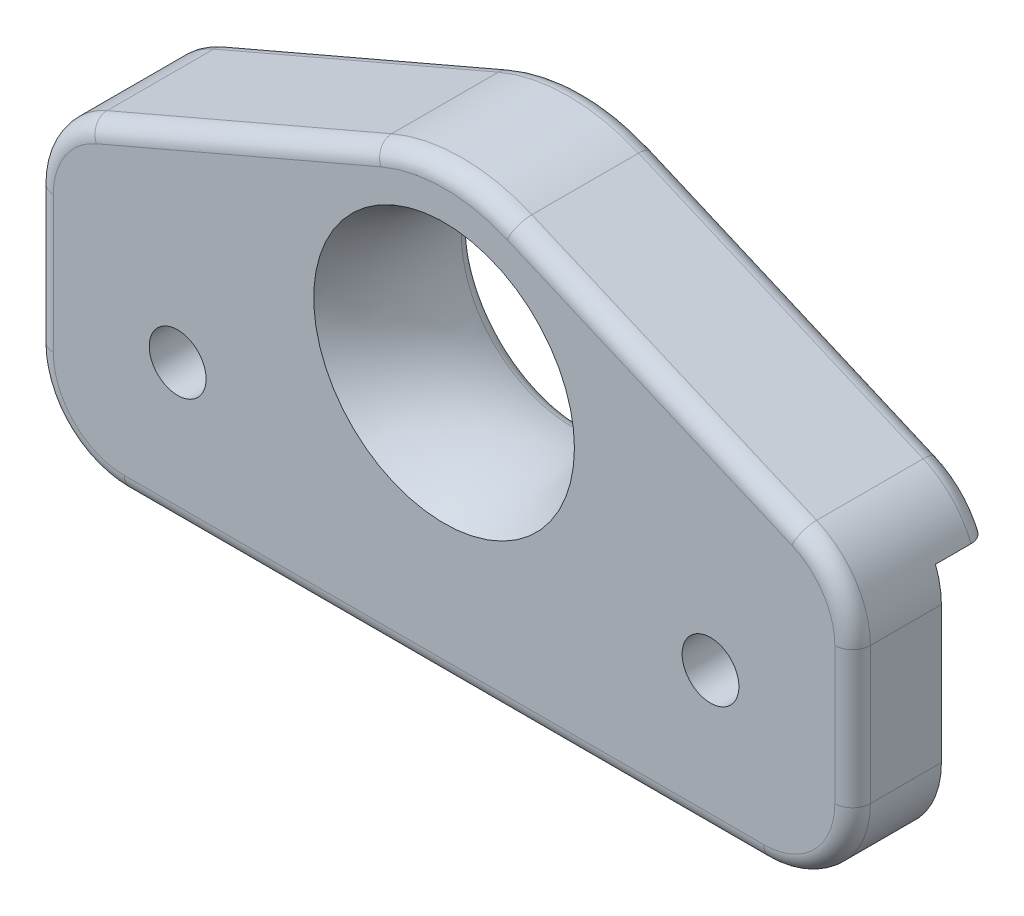
ISO-10303-21;
HEADER;
FILE_DESCRIPTION(('STEP AP214'),'2;1');
FILE_NAME('part.step','',(''),(''),'','','');
FILE_SCHEMA(('AUTOMOTIVE_DESIGN { 1 0 10303 214 1 1 1 1 }'));
ENDSEC;
DATA;
#1=APPLICATION_CONTEXT('core data for automotive mechanical design processes');
#2=APPLICATION_PROTOCOL_DEFINITION('international standard','automotive_design',2000,#1);
#3=PRODUCT_CONTEXT('',#1,'mechanical');
#4=PRODUCT('Part','Part','',(#3));
#5=PRODUCT_RELATED_PRODUCT_CATEGORY('part','',(#4));
#6=PRODUCT_DEFINITION_FORMATION('','',#4);
#7=PRODUCT_DEFINITION_CONTEXT('part definition',#1,'design');
#8=PRODUCT_DEFINITION('design','',#6,#7);
#9=PRODUCT_DEFINITION_SHAPE('','',#8);
#10=(LENGTH_UNIT() NAMED_UNIT(*) SI_UNIT(.MILLI.,.METRE.));
#11=(NAMED_UNIT(*) PLANE_ANGLE_UNIT() SI_UNIT($,.RADIAN.));
#12=(NAMED_UNIT(*) SI_UNIT($,.STERADIAN.) SOLID_ANGLE_UNIT());
#13=UNCERTAINTY_MEASURE_WITH_UNIT(LENGTH_MEASURE(1.E-05),#10,'distance_accuracy_value','');
#14=(GEOMETRIC_REPRESENTATION_CONTEXT(3) GLOBAL_UNCERTAINTY_ASSIGNED_CONTEXT((#13)) GLOBAL_UNIT_ASSIGNED_CONTEXT((#10,
#11,#12)) REPRESENTATION_CONTEXT('',''));
#15=CARTESIAN_POINT('',(0.,0.,0.));
#16=DIRECTION('',(0.,0.,1.));
#17=DIRECTION('',(1.,0.,0.));
#18=AXIS2_PLACEMENT_3D('',#15,#16,#17);
#19=CARTESIAN_POINT('',(-23.,-0.500000000000005,0.));
#20=DIRECTION('',(0.,1.,0.));
#21=DIRECTION('',(-1.,0.,0.));
#22=AXIS2_PLACEMENT_3D('',#19,#20,#21);
#23=PLANE('',#22);
#24=DIRECTION('',(1.,0.,0.));
#25=VECTOR('',#24,1.);
#26=CARTESIAN_POINT('',(-23.,-0.500000000000005,0.));
#27=LINE('',#26,#25);
#28=CARTESIAN_POINT('',(7.98435971133566,-0.499999999999999,0.));
#29=VERTEX_POINT('',#28);
#30=CARTESIAN_POINT('',(21.5754322402372,-0.499999999999996,0.));
#31=VERTEX_POINT('',#30);
#32=EDGE_CURVE('E203',#29,#31,#27,.T.);
#33=ORIENTED_EDGE('',*,*,#32,.T.);
#34=CARTESIAN_POINT('',(21.5754322402372,-0.499999999999997,0.));
#35=CARTESIAN_POINT('',(21.6419406279155,-0.499999999999996,-4.29555678483325E-05));
#36=CARTESIAN_POINT('',(21.7085231135193,-0.499999999999996,0.00530162449804705));
#37=CARTESIAN_POINT('',(21.8401270357918,-0.499999999999996,0.0269033733399253));
#38=CARTESIAN_POINT('',(21.9051420402658,-0.499999999999996,0.0431994888706257));
#39=CARTESIAN_POINT('',(22.0315701648763,-0.499999999999996,0.0869031052285832));
#40=CARTESIAN_POINT('',(22.0929729964198,-0.499999999999996,0.114340737607372));
#41=CARTESIAN_POINT('',(22.2096663555396,-0.499999999999996,0.179938208452123));
#42=CARTESIAN_POINT('',(22.2649672736383,-0.499999999999996,0.218079415366952));
#43=CARTESIAN_POINT('',(22.3633396600314,-0.499999999999996,0.30093072112407));
#44=CARTESIAN_POINT('',(22.4070238014305,-0.499999999999996,0.344912593751883));
#45=CARTESIAN_POINT('',(22.4855839041599,-0.499999999999996,0.440196796855842));
#46=CARTESIAN_POINT('',(22.5204593727202,-0.499999999999996,0.491499536621005));
#47=CARTESIAN_POINT('',(22.5773540011421,-0.499999999999996,0.595264207760719));
#48=CARTESIAN_POINT('',(22.6002023011048,-0.499999999999996,0.647273309684651));
#49=CARTESIAN_POINT('',(22.6362415470775,-0.499999999999996,0.754491026960397));
#50=CARTESIAN_POINT('',(22.6494495978546,-0.499999999999996,0.809693786962876));
#51=CARTESIAN_POINT('',(22.660816495334,-0.499999999999996,0.887835965218752));
#52=CARTESIAN_POINT('',(22.6632489454401,-0.499999999999996,0.910217852013244));
#53=CARTESIAN_POINT('',(22.6664902598927,-0.499999999999996,0.955062682164826));
#54=CARTESIAN_POINT('',(22.6673017314686,-0.499999999999996,0.977525437046325));
#55=CARTESIAN_POINT('',(22.6673028297432,-0.499999999999996,0.999999999999981));
#56=B_SPLINE_CURVE_WITH_KNOTS('',3,(#34,#35,#36,#37,#38,#39,#40,#41,#42,#43,#44,#45,#46,#47,#48,
#49,#50,#51,#52,#53,#54,#55),.UNSPECIFIED.,.F.,.F.,(4,2,2,2,2,2,2,2,2,2,4),(0.,
0.199425013428973,0.399563018176547,0.600245927547438,0.800581655178774,0.985551444115997,
1.17053157824643,1.3400974418541,1.50936170718863,1.57685592382779,1.64424149309941),.UNSPECIFIED.);
#57=CARTESIAN_POINT('',(22.6673028297431,-0.499999999999996,1.));
#58=VERTEX_POINT('',#57);
#59=EDGE_CURVE('E285',#31,#58,#56,.T.);
#60=ORIENTED_EDGE('',*,*,#59,.T.);
#61=DIRECTION('',(0.,0.,-1.));
#62=VECTOR('',#61,1.);
#63=CARTESIAN_POINT('',(22.6673028297431,-0.499999999999996,0.));
#64=LINE('',#63,#62);
#65=CARTESIAN_POINT('',(22.6673028297431,-0.499999999999996,3.));
#66=VERTEX_POINT('',#65);
#67=EDGE_CURVE('E271',#58,#66,#64,.F.);
#68=ORIENTED_EDGE('',*,*,#67,.T.);
#69=DIRECTION('',(1.,0.,0.));
#70=VECTOR('',#69,1.);
#71=CARTESIAN_POINT('',(-23.,-0.500000000000005,3.));
#72=LINE('',#71,#70);
#73=CARTESIAN_POINT('',(7.98435971133566,-0.499999999999999,3.));
#74=VERTEX_POINT('',#73);
#75=EDGE_CURVE('E205',#74,#66,#72,.T.);
#76=ORIENTED_EDGE('',*,*,#75,.F.);
#77=DIRECTION('',(0.,0.,-1.));
#78=VECTOR('',#77,1.);
#79=CARTESIAN_POINT('',(7.98435971133565,-0.499999999999999,25.6274169979695));
#80=LINE('',#79,#78);
#81=EDGE_CURVE('E190',#74,#29,#80,.T.);
#82=ORIENTED_EDGE('',*,*,#81,.T.);
#83=EDGE_LOOP('',(#33,#60,#68,#76,#82));
#84=FACE_BOUND('',#83,.T.);
#85=ADVANCED_FACE('F34',(#84),#23,.F.);
#86=CARTESIAN_POINT('',(0.,0.,8.));
#87=DIRECTION('',(0.,0.,-1.));
#88=DIRECTION('',(-1.,0.,0.));
#89=AXIS2_PLACEMENT_3D('',#86,#87,#88);
#90=PLANE('',#89);
#91=CARTESIAN_POINT('',(18.,-2.29340020504966,8.));
#92=DIRECTION('',(0.,0.,-1.));
#93=DIRECTION('',(-1.,0.,0.));
#94=AXIS2_PLACEMENT_3D('',#91,#92,#93);
#95=CIRCLE('',#94,4.);
#96=CARTESIAN_POINT('',(22.,-2.29340020504965,8.));
#97=VERTEX_POINT('',#96);
#98=CARTESIAN_POINT('',(19.5793476124277,1.38160470911289,8.));
#99=VERTEX_POINT('',#98);
#100=EDGE_CURVE('E523',#97,#99,#95,.F.);
#101=ORIENTED_EDGE('',*,*,#100,.T.);
#102=DIRECTION('',(-0.918751228540637,0.394836903106929,0.));
#103=VECTOR('',#102,1.);
#104=CARTESIAN_POINT('',(3.55353212796237,8.26876105686574,8.));
#105=LINE('',#104,#103);
#106=CARTESIAN_POINT('',(3.55353212796236,8.26876105686574,8.));
#107=VERTEX_POINT('',#106);
#108=EDGE_CURVE('E525',#99,#107,#105,.T.);
#109=ORIENTED_EDGE('',*,*,#108,.T.);
#110=CARTESIAN_POINT('',(0.,0.,8.));
#111=DIRECTION('',(0.,0.,-1.));
#112=DIRECTION('',(-1.,0.,0.));
#113=AXIS2_PLACEMENT_3D('',#110,#111,#112);
#114=CIRCLE('',#113,9.00000000000001);
#115=CARTESIAN_POINT('',(-3.55353212796236,8.26876105686573,8.));
#116=VERTEX_POINT('',#115);
#117=EDGE_CURVE('E547',#107,#116,#114,.F.);
#118=ORIENTED_EDGE('',*,*,#117,.T.);
#119=DIRECTION('',(-0.918751228540637,-0.394836903106929,0.));
#120=VECTOR('',#119,1.);
#121=CARTESIAN_POINT('',(-3.55353212796236,8.26876105686574,8.));
#122=LINE('',#121,#120);
#123=CARTESIAN_POINT('',(-19.5793476124277,1.38160470911289,8.));
#124=VERTEX_POINT('',#123);
#125=EDGE_CURVE('E549',#116,#124,#122,.T.);
#126=ORIENTED_EDGE('',*,*,#125,.T.);
#127=CARTESIAN_POINT('',(-18.,-2.29340020504966,8.));
#128=DIRECTION('',(0.,0.,-1.));
#129=DIRECTION('',(-1.,0.,0.));
#130=AXIS2_PLACEMENT_3D('',#127,#128,#129);
#131=CIRCLE('',#130,4.);
#132=CARTESIAN_POINT('',(-22.,-2.29340020504965,8.));
#133=VERTEX_POINT('',#132);
#134=EDGE_CURVE('E516',#124,#133,#131,.F.);
#135=ORIENTED_EDGE('',*,*,#134,.T.);
#136=DIRECTION('',(0.,-1.,0.));
#137=VECTOR('',#136,1.);
#138=CARTESIAN_POINT('',(-22.,0.,8.));
#139=LINE('',#138,#137);
#140=CARTESIAN_POINT('',(-22.,-9.99999999999999,8.));
#141=VERTEX_POINT('',#140);
#142=EDGE_CURVE('E506',#133,#141,#139,.T.);
#143=ORIENTED_EDGE('',*,*,#142,.T.);
#144=CARTESIAN_POINT('',(-18.,-10.,8.));
#145=DIRECTION('',(0.,0.,-1.));
#146=DIRECTION('',(-1.,0.,0.));
#147=AXIS2_PLACEMENT_3D('',#144,#145,#146);
#148=CIRCLE('',#147,4.);
#149=CARTESIAN_POINT('',(-18.,-14.,8.));
#150=VERTEX_POINT('',#149);
#151=EDGE_CURVE('E510',#141,#150,#148,.F.);
#152=ORIENTED_EDGE('',*,*,#151,.T.);
#153=DIRECTION('',(1.,0.,0.));
#154=VECTOR('',#153,1.);
#155=CARTESIAN_POINT('',(0.,-14.,8.));
#156=LINE('',#155,#154);
#157=CARTESIAN_POINT('',(18.,-14.,8.));
#158=VERTEX_POINT('',#157);
#159=EDGE_CURVE('E512',#150,#158,#156,.T.);
#160=ORIENTED_EDGE('',*,*,#159,.T.);
#161=CARTESIAN_POINT('',(18.,-10.,8.));
#162=DIRECTION('',(0.,0.,-1.));
#163=DIRECTION('',(-1.,0.,0.));
#164=AXIS2_PLACEMENT_3D('',#161,#162,#163);
#165=CIRCLE('',#164,4.);
#166=CARTESIAN_POINT('',(22.,-9.99999999999999,8.));
#167=VERTEX_POINT('',#166);
#168=EDGE_CURVE('E514',#158,#167,#165,.F.);
#169=ORIENTED_EDGE('',*,*,#168,.T.);
#170=DIRECTION('',(0.,1.,0.));
#171=VECTOR('',#170,1.);
#172=CARTESIAN_POINT('',(22.,0.,8.));
#173=LINE('',#172,#171);
#174=EDGE_CURVE('E521',#167,#97,#173,.T.);
#175=ORIENTED_EDGE('',*,*,#174,.T.);
#176=EDGE_LOOP('',(#101,#109,#118,#126,#135,#143,#152,#160,#169,#175));
#177=FACE_BOUND('',#176,.T.);
#178=CARTESIAN_POINT('',(0.,0.,8.));
#179=DIRECTION('',(0.,0.,1.));
#180=DIRECTION('',(1.,0.,0.));
#181=AXIS2_PLACEMENT_3D('',#178,#179,#180);
#182=CIRCLE('',#181,7.33974596215561);
#183=CARTESIAN_POINT('',(7.33974596215561,0.,8.));
#184=VERTEX_POINT('',#183);
#185=EDGE_CURVE('E198',#184,#184,#182,.T.);
#186=ORIENTED_EDGE('',*,*,#185,.F.);
#187=EDGE_LOOP('',(#186));
#188=FACE_BOUND('',#187,.T.);
#189=CARTESIAN_POINT('',(-15.,-7.,8.));
#190=DIRECTION('',(0.,0.,1.));
#191=DIRECTION('',(1.,0.,0.));
#192=AXIS2_PLACEMENT_3D('',#189,#190,#191);
#193=CIRCLE('',#192,1.6);
#194=CARTESIAN_POINT('',(-13.4,-7.,8.));
#195=VERTEX_POINT('',#194);
#196=EDGE_CURVE('E229',#195,#195,#193,.T.);
#197=ORIENTED_EDGE('',*,*,#196,.F.);
#198=EDGE_LOOP('',(#197));
#199=FACE_BOUND('',#198,.T.);
#200=CARTESIAN_POINT('',(15.,-7.,8.));
#201=DIRECTION('',(0.,0.,1.));
#202=DIRECTION('',(-1.,0.,0.));
#203=AXIS2_PLACEMENT_3D('',#200,#201,#202);
#204=CIRCLE('',#203,1.6);
#205=CARTESIAN_POINT('',(13.4,-7.,8.));
#206=VERTEX_POINT('',#205);
#207=EDGE_CURVE('E225',#206,#206,#204,.T.);
#208=ORIENTED_EDGE('',*,*,#207,.F.);
#209=EDGE_LOOP('',(#208));
#210=FACE_BOUND('',#209,.T.);
#211=ADVANCED_FACE('F377',(#177,#188,#199,#210),#90,.F.);
#212=CARTESIAN_POINT('',(0.,0.,0.));
#213=DIRECTION('',(0.,0.,-1.));
#214=DIRECTION('',(-1.,0.,0.));
#215=AXIS2_PLACEMENT_3D('',#212,#213,#214);
#216=PLANE('',#215);
#217=CARTESIAN_POINT('',(0.,0.,0.));
#218=DIRECTION('',(0.,0.,-1.));
#219=DIRECTION('',(-1.,0.,0.));
#220=AXIS2_PLACEMENT_3D('',#217,#218,#219);
#221=CIRCLE('',#220,7.22503561260788);
#222=CARTESIAN_POINT('',(-7.22503561260788,0.,0.));
#223=VERTEX_POINT('',#222);
#224=EDGE_CURVE('E282',#223,#223,#221,.F.);
#225=ORIENTED_EDGE('',*,*,#224,.T.);
#226=EDGE_LOOP('',(#225));
#227=FACE_BOUND('',#226,.T.);
#228=DIRECTION('',(-0.918751228540637,0.394836903106929,0.));
#229=VECTOR('',#228,1.);
#230=CARTESIAN_POINT('',(19.5793476124277,1.38160470911289,0.));
#231=LINE('',#230,#229);
#232=CARTESIAN_POINT('',(3.55353212796236,8.26876105686573,0.));
#233=VERTEX_POINT('',#232);
#234=CARTESIAN_POINT('',(19.5793476124277,1.38160470911289,0.));
#235=VERTEX_POINT('',#234);
#236=EDGE_CURVE('E279',#233,#235,#231,.F.);
#237=ORIENTED_EDGE('',*,*,#236,.T.);
#238=CARTESIAN_POINT('',(18.,-2.29340020504966,0.));
#239=DIRECTION('',(0.,0.,-1.));
#240=DIRECTION('',(-1.,0.,0.));
#241=AXIS2_PLACEMENT_3D('',#238,#239,#240);
#242=CIRCLE('',#241,4.);
#243=EDGE_CURVE('E211',#235,#31,#242,.T.);
#244=ORIENTED_EDGE('',*,*,#243,.T.);
#245=ORIENTED_EDGE('',*,*,#32,.F.);
#246=CARTESIAN_POINT('',(0.,0.,0.));
#247=DIRECTION('',(0.,0.,-1.));
#248=DIRECTION('',(-1.,0.,0.));
#249=AXIS2_PLACEMENT_3D('',#246,#247,#248);
#250=CIRCLE('',#249,8.);
#251=CARTESIAN_POINT('',(-7.98435971133565,-0.500000000000002,0.));
#252=VERTEX_POINT('',#251);
#253=EDGE_CURVE('E186',#29,#252,#250,.T.);
#254=ORIENTED_EDGE('',*,*,#253,.T.);
#255=CARTESIAN_POINT('',(-21.5754322402372,-0.500000000000005,0.));
#256=VERTEX_POINT('',#255);
#257=EDGE_CURVE('E212',#256,#252,#27,.T.);
#258=ORIENTED_EDGE('',*,*,#257,.F.);
#259=CARTESIAN_POINT('',(-18.,-2.29340020504966,0.));
#260=DIRECTION('',(0.,0.,-1.));
#261=DIRECTION('',(-1.,0.,0.));
#262=AXIS2_PLACEMENT_3D('',#259,#260,#261);
#263=CIRCLE('',#262,4.);
#264=CARTESIAN_POINT('',(-19.5793476124277,1.38160470911289,0.));
#265=VERTEX_POINT('',#264);
#266=EDGE_CURVE('E277',#256,#265,#263,.T.);
#267=ORIENTED_EDGE('',*,*,#266,.T.);
#268=DIRECTION('',(-0.918751228540637,-0.394836903106929,0.));
#269=VECTOR('',#268,1.);
#270=CARTESIAN_POINT('',(-3.55353212796236,8.26876105686574,0.));
#271=LINE('',#270,#269);
#272=CARTESIAN_POINT('',(-3.55353212796236,8.26876105686573,0.));
#273=VERTEX_POINT('',#272);
#274=EDGE_CURVE('E275',#265,#273,#271,.F.);
#275=ORIENTED_EDGE('',*,*,#274,.T.);
#276=CARTESIAN_POINT('',(0.,0.,0.));
#277=DIRECTION('',(0.,0.,-1.));
#278=DIRECTION('',(-1.,0.,0.));
#279=AXIS2_PLACEMENT_3D('',#276,#277,#278);
#280=CIRCLE('',#279,9.00000000000001);
#281=EDGE_CURVE('E273',#273,#233,#280,.T.);
#282=ORIENTED_EDGE('',*,*,#281,.T.);
#283=EDGE_LOOP('',(#237,#244,#245,#254,#258,#267,#275,#282));
#284=FACE_BOUND('',#283,.T.);
#285=ADVANCED_FACE('F209',(#227,#284),#216,.T.);
#286=CARTESIAN_POINT('',(-23.,1.,8.));
#287=DIRECTION('',(1.,0.,0.));
#288=DIRECTION('',(0.,1.,0.));
#289=AXIS2_PLACEMENT_3D('',#286,#287,#288);
#290=PLANE('',#289);
#291=DIRECTION('',(0.,0.,-1.));
#292=VECTOR('',#291,1.);
#293=CARTESIAN_POINT('',(-23.,-9.99999999999999,8.));
#294=LINE('',#293,#292);
#295=CARTESIAN_POINT('',(-23.,-10.,3.));
#296=VERTEX_POINT('',#295);
#297=CARTESIAN_POINT('',(-23.,-9.99999999999999,7.));
#298=VERTEX_POINT('',#297);
#299=EDGE_CURVE('E255',#296,#298,#294,.F.);
#300=ORIENTED_EDGE('',*,*,#299,.T.);
#301=DIRECTION('',(0.,-1.,0.));
#302=VECTOR('',#301,1.);
#303=CARTESIAN_POINT('',(-23.,1.,7.));
#304=LINE('',#303,#302);
#305=CARTESIAN_POINT('',(-23.,-2.29340020504965,7.));
#306=VERTEX_POINT('',#305);
#307=EDGE_CURVE('E507',#298,#306,#304,.F.);
#308=ORIENTED_EDGE('',*,*,#307,.T.);
#309=DIRECTION('',(0.,0.,-1.));
#310=VECTOR('',#309,1.);
#311=CARTESIAN_POINT('',(-23.,-2.29340020504965,8.));
#312=LINE('',#311,#310);
#313=CARTESIAN_POINT('',(-23.,-2.29340020504965,3.));
#314=VERTEX_POINT('',#313);
#315=EDGE_CURVE('E253',#306,#314,#312,.T.);
#316=ORIENTED_EDGE('',*,*,#315,.T.);
#317=DIRECTION('',(0.,-1.,0.));
#318=VECTOR('',#317,1.);
#319=CARTESIAN_POINT('',(-23.,-15.,3.));
#320=LINE('',#319,#318);
#321=EDGE_CURVE('E213',#314,#296,#320,.T.);
#322=ORIENTED_EDGE('',*,*,#321,.T.);
#323=EDGE_LOOP('',(#300,#308,#316,#322));
#324=FACE_BOUND('',#323,.T.);
#325=ADVANCED_FACE('F386',(#324),#290,.F.);
#326=CARTESIAN_POINT('',(-23.,-15.,8.));
#327=DIRECTION('',(0.,1.,0.));
#328=DIRECTION('',(0.,0.,1.));
#329=AXIS2_PLACEMENT_3D('',#326,#327,#328);
#330=PLANE('',#329);
#331=DIRECTION('',(0.,0.,-1.));
#332=VECTOR('',#331,1.);
#333=CARTESIAN_POINT('',(18.,-15.,8.));
#334=LINE('',#333,#332);
#335=CARTESIAN_POINT('',(18.,-15.,3.));
#336=VERTEX_POINT('',#335);
#337=CARTESIAN_POINT('',(18.,-15.,7.));
#338=VERTEX_POINT('',#337);
#339=EDGE_CURVE('E206',#336,#338,#334,.F.);
#340=ORIENTED_EDGE('',*,*,#339,.T.);
#341=DIRECTION('',(1.,0.,0.));
#342=VECTOR('',#341,1.);
#343=CARTESIAN_POINT('',(-23.,-15.,7.));
#344=LINE('',#343,#342);
#345=CARTESIAN_POINT('',(-18.,-15.,7.));
#346=VERTEX_POINT('',#345);
#347=EDGE_CURVE('E59',#338,#346,#344,.F.);
#348=ORIENTED_EDGE('',*,*,#347,.T.);
#349=DIRECTION('',(0.,0.,-1.));
#350=VECTOR('',#349,1.);
#351=CARTESIAN_POINT('',(-18.,-15.,8.));
#352=LINE('',#351,#350);
#353=CARTESIAN_POINT('',(-18.,-15.,3.));
#354=VERTEX_POINT('',#353);
#355=EDGE_CURVE('E243',#346,#354,#352,.T.);
#356=ORIENTED_EDGE('',*,*,#355,.T.);
#357=DIRECTION('',(1.,0.,0.));
#358=VECTOR('',#357,1.);
#359=CARTESIAN_POINT('',(-23.,-15.,3.));
#360=LINE('',#359,#358);
#361=EDGE_CURVE('E240',#354,#336,#360,.T.);
#362=ORIENTED_EDGE('',*,*,#361,.T.);
#363=EDGE_LOOP('',(#340,#348,#356,#362));
#364=FACE_BOUND('',#363,.T.);
#365=ADVANCED_FACE('F407',(#364),#330,.F.);
#366=CARTESIAN_POINT('',(23.,1.,8.));
#367=DIRECTION('',(-1.,0.,0.));
#368=DIRECTION('',(0.,-1.,0.));
#369=AXIS2_PLACEMENT_3D('',#366,#367,#368);
#370=PLANE('',#369);
#371=DIRECTION('',(0.,0.,-1.));
#372=VECTOR('',#371,1.);
#373=CARTESIAN_POINT('',(23.,-2.29340020504965,8.));
#374=LINE('',#373,#372);
#375=CARTESIAN_POINT('',(23.,-2.29340020504965,3.));
#376=VERTEX_POINT('',#375);
#377=CARTESIAN_POINT('',(23.,-2.29340020504965,7.));
#378=VERTEX_POINT('',#377);
#379=EDGE_CURVE('E263',#376,#378,#374,.F.);
#380=ORIENTED_EDGE('',*,*,#379,.T.);
#381=DIRECTION('',(0.,1.,0.));
#382=VECTOR('',#381,1.);
#383=CARTESIAN_POINT('',(23.,1.,7.));
#384=LINE('',#383,#382);
#385=CARTESIAN_POINT('',(23.,-9.99999999999999,7.));
#386=VERTEX_POINT('',#385);
#387=EDGE_CURVE('E528',#378,#386,#384,.F.);
#388=ORIENTED_EDGE('',*,*,#387,.T.);
#389=DIRECTION('',(0.,0.,-1.));
#390=VECTOR('',#389,1.);
#391=CARTESIAN_POINT('',(23.,-9.99999999999999,8.));
#392=LINE('',#391,#390);
#393=CARTESIAN_POINT('',(23.,-10.,3.));
#394=VERTEX_POINT('',#393);
#395=EDGE_CURVE('E266',#386,#394,#392,.T.);
#396=ORIENTED_EDGE('',*,*,#395,.T.);
#397=DIRECTION('',(0.,-1.,0.));
#398=VECTOR('',#397,1.);
#399=CARTESIAN_POINT('',(23.,-15.,3.));
#400=LINE('',#399,#398);
#401=EDGE_CURVE('E216',#376,#394,#400,.T.);
#402=ORIENTED_EDGE('',*,*,#401,.F.);
#403=EDGE_LOOP('',(#380,#388,#396,#402));
#404=FACE_BOUND('',#403,.T.);
#405=ADVANCED_FACE('F403',(#404),#370,.F.);
#406=CARTESIAN_POINT('',(3.94836903106929,9.18751228540637,8.));
#407=DIRECTION('',(-0.394836903106929,-0.918751228540637,0.));
#408=DIRECTION('',(0.918751228540637,-0.394836903106929,0.));
#409=AXIS2_PLACEMENT_3D('',#406,#407,#408);
#410=PLANE('',#409);
#411=DIRECTION('',(0.,0.,-1.));
#412=VECTOR('',#411,1.);
#413=CARTESIAN_POINT('',(19.9741845155346,2.30035593765353,8.));
#414=LINE('',#413,#412);
#415=CARTESIAN_POINT('',(19.9741845155346,2.30035593765353,7.));
#416=VERTEX_POINT('',#415);
#417=CARTESIAN_POINT('',(19.9741845155346,2.30035593765353,1.));
#418=VERTEX_POINT('',#417);
#419=EDGE_CURVE('E268',#416,#418,#414,.T.);
#420=ORIENTED_EDGE('',*,*,#419,.T.);
#421=DIRECTION('',(-0.918751228540637,0.394836903106929,0.));
#422=VECTOR('',#421,1.);
#423=CARTESIAN_POINT('',(3.94836903106929,9.18751228540637,1.));
#424=LINE('',#423,#422);
#425=CARTESIAN_POINT('',(3.94836903106929,9.18751228540637,1.));
#426=VERTEX_POINT('',#425);
#427=EDGE_CURVE('E440',#418,#426,#424,.T.);
#428=ORIENTED_EDGE('',*,*,#427,.T.);
#429=DIRECTION('',(0.,0.,-1.));
#430=VECTOR('',#429,1.);
#431=CARTESIAN_POINT('',(3.94836903106929,9.18751228540637,8.));
#432=LINE('',#431,#430);
#433=CARTESIAN_POINT('',(3.94836903106929,9.18751228540637,7.));
#434=VERTEX_POINT('',#433);
#435=EDGE_CURVE('E235',#434,#426,#432,.T.);
#436=ORIENTED_EDGE('',*,*,#435,.F.);
#437=DIRECTION('',(-0.918751228540637,0.394836903106929,0.));
#438=VECTOR('',#437,1.);
#439=CARTESIAN_POINT('',(3.94836903106929,9.18751228540637,7.));
#440=LINE('',#439,#438);
#441=EDGE_CURVE('E438',#434,#416,#440,.F.);
#442=ORIENTED_EDGE('',*,*,#441,.T.);
#443=EDGE_LOOP('',(#420,#428,#436,#442));
#444=FACE_BOUND('',#443,.T.);
#445=ADVANCED_FACE('F399',(#444),#410,.F.);
#446=CARTESIAN_POINT('',(0.,0.,8.));
#447=DIRECTION('',(0.,0.,-1.));
#448=DIRECTION('',(-1.,0.,0.));
#449=AXIS2_PLACEMENT_3D('',#446,#447,#448);
#450=CYLINDRICAL_SURFACE('',#449,10.);
#451=ORIENTED_EDGE('',*,*,#435,.T.);
#452=CARTESIAN_POINT('',(0.,0.,1.));
#453=DIRECTION('',(0.,0.,-1.));
#454=DIRECTION('',(-1.,0.,0.));
#455=AXIS2_PLACEMENT_3D('',#452,#453,#454);
#456=CIRCLE('',#455,10.);
#457=CARTESIAN_POINT('',(-3.94836903106929,9.18751228540637,1.));
#458=VERTEX_POINT('',#457);
#459=EDGE_CURVE('E11',#426,#458,#456,.F.);
#460=ORIENTED_EDGE('',*,*,#459,.T.);
#461=DIRECTION('',(0.,0.,-1.));
#462=VECTOR('',#461,1.);
#463=CARTESIAN_POINT('',(-3.94836903106929,9.18751228540637,8.));
#464=LINE('',#463,#462);
#465=CARTESIAN_POINT('',(-3.94836903106929,9.18751228540637,7.));
#466=VERTEX_POINT('',#465);
#467=EDGE_CURVE('E232',#466,#458,#464,.T.);
#468=ORIENTED_EDGE('',*,*,#467,.F.);
#469=CARTESIAN_POINT('',(0.,0.,7.));
#470=DIRECTION('',(0.,0.,-1.));
#471=DIRECTION('',(-1.,0.,0.));
#472=AXIS2_PLACEMENT_3D('',#469,#470,#471);
#473=CIRCLE('',#472,10.);
#474=EDGE_CURVE('E43',#466,#434,#473,.T.);
#475=ORIENTED_EDGE('',*,*,#474,.T.);
#476=EDGE_LOOP('',(#451,#460,#468,#475));
#477=FACE_BOUND('',#476,.T.);
#478=ADVANCED_FACE('F395',(#477),#450,.T.);
#479=CARTESIAN_POINT('',(-23.,1.,8.));
#480=DIRECTION('',(0.394836903106929,-0.918751228540637,0.));
#481=DIRECTION('',(0.918751228540637,0.394836903106929,0.));
#482=AXIS2_PLACEMENT_3D('',#479,#480,#481);
#483=PLANE('',#482);
#484=ORIENTED_EDGE('',*,*,#467,.T.);
#485=DIRECTION('',(-0.918751228540637,-0.394836903106929,0.));
#486=VECTOR('',#485,1.);
#487=CARTESIAN_POINT('',(-19.9741845155346,2.30035593765353,1.));
#488=LINE('',#487,#486);
#489=CARTESIAN_POINT('',(-19.9741845155346,2.30035593765353,1.));
#490=VERTEX_POINT('',#489);
#491=EDGE_CURVE('E464',#458,#490,#488,.T.);
#492=ORIENTED_EDGE('',*,*,#491,.T.);
#493=DIRECTION('',(0.,0.,-1.));
#494=VECTOR('',#493,1.);
#495=CARTESIAN_POINT('',(-19.9741845155346,2.30035593765353,8.));
#496=LINE('',#495,#494);
#497=CARTESIAN_POINT('',(-19.9741845155346,2.30035593765353,7.));
#498=VERTEX_POINT('',#497);
#499=EDGE_CURVE('E260',#490,#498,#496,.F.);
#500=ORIENTED_EDGE('',*,*,#499,.T.);
#501=DIRECTION('',(-0.918751228540637,-0.394836903106929,0.));
#502=VECTOR('',#501,1.);
#503=CARTESIAN_POINT('',(-23.,1.,7.));
#504=LINE('',#503,#502);
#505=EDGE_CURVE('E319',#498,#466,#504,.F.);
#506=ORIENTED_EDGE('',*,*,#505,.T.);
#507=EDGE_LOOP('',(#484,#492,#500,#506));
#508=FACE_BOUND('',#507,.T.);
#509=ADVANCED_FACE('F392',(#508),#483,.F.);
#510=CARTESIAN_POINT('',(-15.,-7.,8.));
#511=DIRECTION('',(0.,0.,-1.));
#512=DIRECTION('',(-1.,0.,0.));
#513=AXIS2_PLACEMENT_3D('',#510,#511,#512);
#514=CYLINDRICAL_SURFACE('',#513,1.6);
#515=CARTESIAN_POINT('',(-15.,-7.,3.));
#516=DIRECTION('',(0.,0.,1.));
#517=DIRECTION('',(1.,0.,0.));
#518=AXIS2_PLACEMENT_3D('',#515,#516,#517);
#519=CIRCLE('',#518,1.6);
#520=CARTESIAN_POINT('',(-13.4,-7.,3.));
#521=VERTEX_POINT('',#520);
#522=EDGE_CURVE('E222',#521,#521,#519,.T.);
#523=ORIENTED_EDGE('',*,*,#522,.F.);
#524=EDGE_LOOP('',(#523));
#525=FACE_BOUND('',#524,.T.);
#526=ORIENTED_EDGE('',*,*,#196,.T.);
#527=EDGE_LOOP('',(#526));
#528=FACE_BOUND('',#527,.T.);
#529=ADVANCED_FACE('F390',(#525,#528),#514,.F.);
#530=CARTESIAN_POINT('',(15.,-7.,8.));
#531=DIRECTION('',(0.,0.,-1.));
#532=DIRECTION('',(-1.,0.,0.));
#533=AXIS2_PLACEMENT_3D('',#530,#531,#532);
#534=CYLINDRICAL_SURFACE('',#533,1.6);
#535=CARTESIAN_POINT('',(15.,-7.,3.));
#536=DIRECTION('',(0.,0.,1.));
#537=DIRECTION('',(1.,0.,0.));
#538=AXIS2_PLACEMENT_3D('',#535,#536,#537);
#539=CIRCLE('',#538,1.6);
#540=CARTESIAN_POINT('',(16.6,-7.,3.));
#541=VERTEX_POINT('',#540);
#542=EDGE_CURVE('E226',#541,#541,#539,.T.);
#543=ORIENTED_EDGE('',*,*,#542,.F.);
#544=EDGE_LOOP('',(#543));
#545=FACE_BOUND('',#544,.T.);
#546=ORIENTED_EDGE('',*,*,#207,.T.);
#547=EDGE_LOOP('',(#546));
#548=FACE_BOUND('',#547,.T.);
#549=ADVANCED_FACE('F307',(#545,#548),#534,.F.);
#550=CARTESIAN_POINT('',(-23.,-15.,3.));
#551=DIRECTION('',(0.,0.,1.));
#552=DIRECTION('',(1.,0.,0.));
#553=AXIS2_PLACEMENT_3D('',#550,#551,#552);
#554=PLANE('',#553);
#555=ORIENTED_EDGE('',*,*,#522,.T.);
#556=EDGE_LOOP('',(#555));
#557=FACE_BOUND('',#556,.T.);
#558=ORIENTED_EDGE('',*,*,#542,.T.);
#559=EDGE_LOOP('',(#558));
#560=FACE_BOUND('',#559,.T.);
#561=ORIENTED_EDGE('',*,*,#361,.F.);
#562=CARTESIAN_POINT('',(-18.,-10.,3.));
#563=DIRECTION('',(0.,0.,1.));
#564=DIRECTION('',(1.,0.,0.));
#565=AXIS2_PLACEMENT_3D('',#562,#563,#564);
#566=CIRCLE('',#565,5.);
#567=EDGE_CURVE('E251',#354,#296,#566,.F.);
#568=ORIENTED_EDGE('',*,*,#567,.T.);
#569=ORIENTED_EDGE('',*,*,#321,.F.);
#570=CARTESIAN_POINT('',(-18.,-2.29340020504966,3.));
#571=DIRECTION('',(0.,0.,1.));
#572=DIRECTION('',(1.,0.,0.));
#573=AXIS2_PLACEMENT_3D('',#570,#571,#572);
#574=CIRCLE('',#573,5.);
#575=CARTESIAN_POINT('',(-22.6673028297431,-0.500000000000005,3.));
#576=VERTEX_POINT('',#575);
#577=EDGE_CURVE('E249',#314,#576,#574,.F.);
#578=ORIENTED_EDGE('',*,*,#577,.T.);
#579=CARTESIAN_POINT('',(-7.98435971133565,-0.500000000000002,3.));
#580=VERTEX_POINT('',#579);
#581=EDGE_CURVE('E220',#576,#580,#72,.T.);
#582=ORIENTED_EDGE('',*,*,#581,.T.);
#583=CARTESIAN_POINT('',(0.,0.,3.));
#584=DIRECTION('',(0.,0.,1.));
#585=DIRECTION('',(1.,0.,0.));
#586=AXIS2_PLACEMENT_3D('',#583,#584,#585);
#587=CIRCLE('',#586,8.);
#588=EDGE_CURVE('E197',#74,#580,#587,.F.);
#589=ORIENTED_EDGE('',*,*,#588,.F.);
#590=ORIENTED_EDGE('',*,*,#75,.T.);
#591=CARTESIAN_POINT('',(18.,-2.29340020504966,3.));
#592=DIRECTION('',(0.,0.,1.));
#593=DIRECTION('',(1.,0.,0.));
#594=AXIS2_PLACEMENT_3D('',#591,#592,#593);
#595=CIRCLE('',#594,5.);
#596=EDGE_CURVE('E245',#66,#376,#595,.F.);
#597=ORIENTED_EDGE('',*,*,#596,.T.);
#598=ORIENTED_EDGE('',*,*,#401,.T.);
#599=CARTESIAN_POINT('',(18.,-10.,3.));
#600=DIRECTION('',(0.,0.,1.));
#601=DIRECTION('',(1.,0.,0.));
#602=AXIS2_PLACEMENT_3D('',#599,#600,#601);
#603=CIRCLE('',#602,5.);
#604=EDGE_CURVE('E247',#394,#336,#603,.F.);
#605=ORIENTED_EDGE('',*,*,#604,.T.);
#606=EDGE_LOOP('',(#561,#568,#569,#578,#582,#589,#590,#597,#598,#605));
#607=FACE_BOUND('',#606,.T.);
#608=ADVANCED_FACE('F304',(#557,#560,#607),#554,.F.);
#609=DIRECTION('',(0.,0.,-1.));
#610=VECTOR('',#609,1.);
#611=CARTESIAN_POINT('',(-22.6673028297431,-0.500000000000005,3.));
#612=LINE('',#611,#610);
#613=CARTESIAN_POINT('',(-22.6673028297431,-0.500000000000005,1.));
#614=VERTEX_POINT('',#613);
#615=EDGE_CURVE('E257',#576,#614,#612,.T.);
#616=ORIENTED_EDGE('',*,*,#615,.T.);
#617=CARTESIAN_POINT('',(-22.6673028297431,-0.500000000000005,1.));
#618=CARTESIAN_POINT('',(-22.6673034143492,-0.500000000000005,0.973301045978481));
#619=CARTESIAN_POINT('',(-22.6661565716808,-0.500000000000005,0.946615297101948));
#620=CARTESIAN_POINT('',(-22.6615866136949,-0.500000000000005,0.893443612858241));
#621=CARTESIAN_POINT('',(-22.6581638575142,-0.500000000000005,0.866957646632365));
#622=CARTESIAN_POINT('',(-22.6445383385433,-0.500000000000005,0.788216116551872));
#623=CARTESIAN_POINT('',(-22.6309780454666,-0.500000000000005,0.736502893391578));
#624=CARTESIAN_POINT('',(-22.5954004299185,-0.500000000000005,0.636115295985914));
#625=CARTESIAN_POINT('',(-22.5733835535473,-0.500000000000005,0.587440761601625));
#626=CARTESIAN_POINT('',(-22.5216687471311,-0.500000000000005,0.494349114494088));
#627=CARTESIAN_POINT('',(-22.4919687015658,-0.500000000000005,0.449933178977704));
#628=CARTESIAN_POINT('',(-22.4250938763386,-0.500000000000005,0.365427885428571));
#629=CARTESIAN_POINT('',(-22.3877592174524,-0.500000000000005,0.325465390755119));
#630=CARTESIAN_POINT('',(-22.3072680712634,-0.500000000000005,0.251934292798943));
#631=CARTESIAN_POINT('',(-22.2641109397888,-0.500000000000005,0.218366397978115));
#632=CARTESIAN_POINT('',(-22.1703656951894,-0.500000000000005,0.156293881814237));
#633=CARTESIAN_POINT('',(-22.1194817062166,-0.500000000000005,0.128236939894736));
#634=CARTESIAN_POINT('',(-22.0139633071391,-0.500000000000005,0.0803098716509999));
#635=CARTESIAN_POINT('',(-21.9593257389228,-0.500000000000005,0.0604467401632536));
#636=CARTESIAN_POINT('',(-21.8501729516088,-0.500000000000005,0.0297348162054484));
#637=CARTESIAN_POINT('',(-21.7957564941782,-0.500000000000005,0.0185303934804904));
#638=CARTESIAN_POINT('',(-21.6860253263707,-0.500000000000005,0.00366278614648456));
#639=CARTESIAN_POINT('',(-21.6307129731517,-0.500000000000005,-1.77056405773203E-05));
#640=CARTESIAN_POINT('',(-21.5754322402372,-0.500000000000005,0.));
#641=B_SPLINE_CURVE_WITH_KNOTS('',3,(#617,#618,#619,#620,#621,#622,#623,#624,#625,#626,#627,
#628,#629,#630,#631,#632,#633,#634,#635,#636,#637,#638,#639,#640),.UNSPECIFIED.,.F.,.F.,(4,2,2,
2,2,2,2,2,2,2,2,4),(0.,0.0800462250241171,0.16007982183686,0.319631767933529,0.479175298531217,
0.638762805446692,0.802117030493787,0.96548934314999,1.13907419396925,1.3128069243878,
1.47895622045251,1.64472289392736),.UNSPECIFIED.);
#642=EDGE_CURVE('E311',#614,#256,#641,.T.);
#643=ORIENTED_EDGE('',*,*,#642,.T.);
#644=ORIENTED_EDGE('',*,*,#257,.T.);
#645=DIRECTION('',(0.,0.,-1.));
#646=VECTOR('',#645,1.);
#647=CARTESIAN_POINT('',(-7.98435971133565,-0.500000000000002,25.6274169979695));
#648=LINE('',#647,#646);
#649=EDGE_CURVE('E193',#252,#580,#648,.F.);
#650=ORIENTED_EDGE('',*,*,#649,.T.);
#651=ORIENTED_EDGE('',*,*,#581,.F.);
#652=EDGE_LOOP('',(#616,#643,#644,#650,#651));
#653=FACE_BOUND('',#652,.T.);
#654=ADVANCED_FACE('F299',(#653),#23,.F.);
#655=CARTESIAN_POINT('',(0.,0.,25.6274169979695));
#656=DIRECTION('',(0.,0.,-1.));
#657=DIRECTION('',(-1.,0.,0.));
#658=AXIS2_PLACEMENT_3D('',#655,#656,#657);
#659=CYLINDRICAL_SURFACE('',#658,8.);
#660=ORIENTED_EDGE('',*,*,#81,.F.);
#661=ORIENTED_EDGE('',*,*,#588,.T.);
#662=ORIENTED_EDGE('',*,*,#649,.F.);
#663=ORIENTED_EDGE('',*,*,#253,.F.);
#664=EDGE_LOOP('',(#660,#661,#662,#663));
#665=FACE_BOUND('',#664,.T.);
#666=ADVANCED_FACE('F188',(#665),#659,.T.);
#667=CARTESIAN_POINT('',(0.,0.,3.));
#668=DIRECTION('',(0.,0.,1.));
#669=DIRECTION('',(1.,0.,0.));
#670=AXIS2_PLACEMENT_3D('',#667,#668,#669);
#671=TOROIDAL_SURFACE('',#670,16.,10.);
#672=CARTESIAN_POINT('',(0.,0.,0.777777777777777));
#673=DIRECTION('',(0.,0.,1.));
#674=DIRECTION('',(1.,0.,0.));
#675=AXIS2_PLACEMENT_3D('',#672,#673,#674);
#676=CIRCLE('',#675,6.25003956956431);
#677=CARTESIAN_POINT('',(6.25003956956431,0.,0.777777777777777));
#678=VERTEX_POINT('',#677);
#679=EDGE_CURVE('E535',#678,#678,#676,.F.);
#680=ORIENTED_EDGE('',*,*,#679,.T.);
#681=EDGE_LOOP('',(#680));
#682=FACE_BOUND('',#681,.T.);
#683=ORIENTED_EDGE('',*,*,#185,.T.);
#684=EDGE_LOOP('',(#683));
#685=FACE_BOUND('',#684,.T.);
#686=ADVANCED_FACE('F418',(#682,#685),#671,.T.);
#687=CARTESIAN_POINT('',(-18.,-10.,8.));
#688=DIRECTION('',(0.,0.,-1.));
#689=DIRECTION('',(-1.,0.,0.));
#690=AXIS2_PLACEMENT_3D('',#687,#688,#689);
#691=CYLINDRICAL_SURFACE('',#690,5.);
#692=ORIENTED_EDGE('',*,*,#355,.F.);
#693=CARTESIAN_POINT('',(-18.,-10.,7.));
#694=DIRECTION('',(0.,0.,-1.));
#695=DIRECTION('',(-1.,0.,0.));
#696=AXIS2_PLACEMENT_3D('',#693,#694,#695);
#697=CIRCLE('',#696,5.);
#698=EDGE_CURVE('E51',#346,#298,#697,.T.);
#699=ORIENTED_EDGE('',*,*,#698,.T.);
#700=ORIENTED_EDGE('',*,*,#299,.F.);
#701=ORIENTED_EDGE('',*,*,#567,.F.);
#702=EDGE_LOOP('',(#692,#699,#700,#701));
#703=FACE_BOUND('',#702,.T.);
#704=ADVANCED_FACE('F414',(#703),#691,.T.);
#705=CARTESIAN_POINT('',(-18.,-2.29340020504966,8.));
#706=DIRECTION('',(0.,0.,-1.));
#707=DIRECTION('',(-1.,0.,0.));
#708=AXIS2_PLACEMENT_3D('',#705,#706,#707);
#709=CYLINDRICAL_SURFACE('',#708,5.);
#710=ORIENTED_EDGE('',*,*,#499,.F.);
#711=CARTESIAN_POINT('',(-18.,-2.29340020504966,1.));
#712=DIRECTION('',(0.,0.,-1.));
#713=DIRECTION('',(-1.,0.,0.));
#714=AXIS2_PLACEMENT_3D('',#711,#712,#713);
#715=CIRCLE('',#714,5.);
#716=EDGE_CURVE('E320',#490,#614,#715,.F.);
#717=ORIENTED_EDGE('',*,*,#716,.T.);
#718=ORIENTED_EDGE('',*,*,#615,.F.);
#719=ORIENTED_EDGE('',*,*,#577,.F.);
#720=ORIENTED_EDGE('',*,*,#315,.F.);
#721=CARTESIAN_POINT('',(-18.,-2.29340020504966,7.));
#722=DIRECTION('',(0.,0.,-1.));
#723=DIRECTION('',(-1.,0.,0.));
#724=AXIS2_PLACEMENT_3D('',#721,#722,#723);
#725=CIRCLE('',#724,5.);
#726=EDGE_CURVE('E443',#306,#498,#725,.T.);
#727=ORIENTED_EDGE('',*,*,#726,.T.);
#728=EDGE_LOOP('',(#710,#717,#718,#719,#720,#727));
#729=FACE_BOUND('',#728,.T.);
#730=ADVANCED_FACE('F417',(#729),#709,.T.);
#731=CARTESIAN_POINT('',(18.,-10.,8.));
#732=DIRECTION('',(0.,0.,-1.));
#733=DIRECTION('',(-1.,0.,0.));
#734=AXIS2_PLACEMENT_3D('',#731,#732,#733);
#735=CYLINDRICAL_SURFACE('',#734,5.);
#736=ORIENTED_EDGE('',*,*,#395,.F.);
#737=CARTESIAN_POINT('',(18.,-10.,7.));
#738=DIRECTION('',(0.,0.,-1.));
#739=DIRECTION('',(-1.,0.,0.));
#740=AXIS2_PLACEMENT_3D('',#737,#738,#739);
#741=CIRCLE('',#740,5.);
#742=EDGE_CURVE('E530',#386,#338,#741,.T.);
#743=ORIENTED_EDGE('',*,*,#742,.T.);
#744=ORIENTED_EDGE('',*,*,#339,.F.);
#745=ORIENTED_EDGE('',*,*,#604,.F.);
#746=EDGE_LOOP('',(#736,#743,#744,#745));
#747=FACE_BOUND('',#746,.T.);
#748=ADVANCED_FACE('F421',(#747),#735,.T.);
#749=CARTESIAN_POINT('',(18.,-2.29340020504966,8.));
#750=DIRECTION('',(0.,0.,-1.));
#751=DIRECTION('',(-1.,0.,0.));
#752=AXIS2_PLACEMENT_3D('',#749,#750,#751);
#753=CYLINDRICAL_SURFACE('',#752,5.);
#754=ORIENTED_EDGE('',*,*,#67,.F.);
#755=CARTESIAN_POINT('',(18.,-2.29340020504966,1.));
#756=DIRECTION('',(0.,0.,-1.));
#757=DIRECTION('',(-1.,0.,0.));
#758=AXIS2_PLACEMENT_3D('',#755,#756,#757);
#759=CIRCLE('',#758,5.);
#760=EDGE_CURVE('E433',#58,#418,#759,.F.);
#761=ORIENTED_EDGE('',*,*,#760,.T.);
#762=ORIENTED_EDGE('',*,*,#419,.F.);
#763=CARTESIAN_POINT('',(18.,-2.29340020504966,7.));
#764=DIRECTION('',(0.,0.,-1.));
#765=DIRECTION('',(-1.,0.,0.));
#766=AXIS2_PLACEMENT_3D('',#763,#764,#765);
#767=CIRCLE('',#766,5.);
#768=EDGE_CURVE('E293',#416,#378,#767,.T.);
#769=ORIENTED_EDGE('',*,*,#768,.T.);
#770=ORIENTED_EDGE('',*,*,#379,.F.);
#771=ORIENTED_EDGE('',*,*,#596,.F.);
#772=EDGE_LOOP('',(#754,#761,#762,#769,#770,#771));
#773=FACE_BOUND('',#772,.T.);
#774=ADVANCED_FACE('F329',(#773),#753,.T.);
#775=CARTESIAN_POINT('',(-18.,-2.29340020504966,1.));
#776=DIRECTION('',(0.,0.,-1.));
#777=DIRECTION('',(-1.,0.,0.));
#778=AXIS2_PLACEMENT_3D('',#775,#776,#777);
#779=TOROIDAL_SURFACE('',#778,4.,1.);
#780=ORIENTED_EDGE('',*,*,#642,.F.);
#781=ORIENTED_EDGE('',*,*,#716,.F.);
#782=CARTESIAN_POINT('',(-19.5793476124277,1.38160470911289,1.));
#783=DIRECTION('',(0.918751228540637,0.394836903106928,0.));
#784=DIRECTION('',(-0.394836903106929,0.918751228540637,0.));
#785=AXIS2_PLACEMENT_3D('',#782,#783,#784);
#786=CIRCLE('',#785,1.);
#787=EDGE_CURVE('E455',#265,#490,#786,.T.);
#788=ORIENTED_EDGE('',*,*,#787,.F.);
#789=ORIENTED_EDGE('',*,*,#266,.F.);
#790=EDGE_LOOP('',(#780,#781,#788,#789));
#791=FACE_BOUND('',#790,.T.);
#792=ADVANCED_FACE('F323',(#791),#779,.T.);
#793=CARTESIAN_POINT('',(-22.6051630968931,0.0812487714593631,1.));
#794=DIRECTION('',(0.918751228540637,0.394836903106929,0.));
#795=DIRECTION('',(-0.394836903106929,0.918751228540637,0.));
#796=AXIS2_PLACEMENT_3D('',#793,#794,#795);
#797=CYLINDRICAL_SURFACE('',#796,1.);
#798=ORIENTED_EDGE('',*,*,#787,.T.);
#799=ORIENTED_EDGE('',*,*,#491,.F.);
#800=CARTESIAN_POINT('',(-3.55353212796236,8.26876105686574,1.));
#801=DIRECTION('',(0.918751228540637,0.394836903106929,0.));
#802=DIRECTION('',(-0.394836903106929,0.918751228540637,0.));
#803=AXIS2_PLACEMENT_3D('',#800,#801,#802);
#804=CIRCLE('',#803,1.);
#805=EDGE_CURVE('E463',#273,#458,#804,.T.);
#806=ORIENTED_EDGE('',*,*,#805,.F.);
#807=ORIENTED_EDGE('',*,*,#274,.F.);
#808=EDGE_LOOP('',(#798,#799,#806,#807));
#809=FACE_BOUND('',#808,.T.);
#810=ADVANCED_FACE('F328',(#809),#797,.T.);
#811=CARTESIAN_POINT('',(0.,0.,1.));
#812=DIRECTION('',(0.,0.,-1.));
#813=DIRECTION('',(-1.,0.,0.));
#814=AXIS2_PLACEMENT_3D('',#811,#812,#813);
#815=TOROIDAL_SURFACE('',#814,9.00000000000001,1.);
#816=ORIENTED_EDGE('',*,*,#805,.T.);
#817=ORIENTED_EDGE('',*,*,#459,.F.);
#818=CARTESIAN_POINT('',(3.55353212796236,8.26876105686573,1.));
#819=DIRECTION('',(0.918751228540637,-0.394836903106929,0.));
#820=DIRECTION('',(0.394836903106929,0.918751228540637,0.));
#821=AXIS2_PLACEMENT_3D('',#818,#819,#820);
#822=CIRCLE('',#821,1.);
#823=EDGE_CURVE('E467',#233,#426,#822,.T.);
#824=ORIENTED_EDGE('',*,*,#823,.F.);
#825=ORIENTED_EDGE('',*,*,#281,.F.);
#826=EDGE_LOOP('',(#816,#817,#824,#825));
#827=FACE_BOUND('',#826,.T.);
#828=ADVANCED_FACE('F469',(#827),#815,.T.);
#829=CARTESIAN_POINT('',(3.55353212796236,8.26876105686574,1.));
#830=DIRECTION('',(0.918751228540637,-0.394836903106929,0.));
#831=DIRECTION('',(0.394836903106929,0.918751228540637,0.));
#832=AXIS2_PLACEMENT_3D('',#829,#830,#831);
#833=CYLINDRICAL_SURFACE('',#832,1.);
#834=ORIENTED_EDGE('',*,*,#823,.T.);
#835=ORIENTED_EDGE('',*,*,#427,.F.);
#836=CARTESIAN_POINT('',(19.5793476124277,1.38160470911289,1.));
#837=DIRECTION('',(0.918751228540637,-0.394836903106928,0.));
#838=DIRECTION('',(0.394836903106928,0.918751228540637,0.));
#839=AXIS2_PLACEMENT_3D('',#836,#837,#838);
#840=CIRCLE('',#839,1.);
#841=EDGE_CURVE('E437',#235,#418,#840,.T.);
#842=ORIENTED_EDGE('',*,*,#841,.F.);
#843=ORIENTED_EDGE('',*,*,#236,.F.);
#844=EDGE_LOOP('',(#834,#835,#842,#843));
#845=FACE_BOUND('',#844,.T.);
#846=ADVANCED_FACE('F373',(#845),#833,.T.);
#847=CARTESIAN_POINT('',(18.,-2.29340020504966,1.));
#848=DIRECTION('',(0.,0.,-1.));
#849=DIRECTION('',(-1.,0.,0.));
#850=AXIS2_PLACEMENT_3D('',#847,#848,#849);
#851=TOROIDAL_SURFACE('',#850,4.,1.);
#852=ORIENTED_EDGE('',*,*,#841,.T.);
#853=ORIENTED_EDGE('',*,*,#760,.F.);
#854=ORIENTED_EDGE('',*,*,#59,.F.);
#855=ORIENTED_EDGE('',*,*,#243,.F.);
#856=EDGE_LOOP('',(#852,#853,#854,#855));
#857=FACE_BOUND('',#856,.T.);
#858=ADVANCED_FACE('F295',(#857),#851,.T.);
#859=CARTESIAN_POINT('',(-18.,-10.,7.));
#860=DIRECTION('',(0.,0.,-1.));
#861=DIRECTION('',(-1.,0.,0.));
#862=AXIS2_PLACEMENT_3D('',#859,#860,#861);
#863=TOROIDAL_SURFACE('',#862,4.,1.);
#864=CARTESIAN_POINT('',(-22.,-9.99999999999999,7.));
#865=DIRECTION('',(0.,1.,0.));
#866=DIRECTION('',(0.,0.,1.));
#867=AXIS2_PLACEMENT_3D('',#864,#865,#866);
#868=CIRCLE('',#867,1.);
#869=EDGE_CURVE('E477',#298,#141,#868,.T.);
#870=ORIENTED_EDGE('',*,*,#869,.F.);
#871=ORIENTED_EDGE('',*,*,#698,.F.);
#872=CARTESIAN_POINT('',(-18.,-14.,7.));
#873=DIRECTION('',(1.,0.,0.));
#874=DIRECTION('',(0.,0.,-1.));
#875=AXIS2_PLACEMENT_3D('',#872,#873,#874);
#876=CIRCLE('',#875,1.);
#877=EDGE_CURVE('E38',#150,#346,#876,.T.);
#878=ORIENTED_EDGE('',*,*,#877,.F.);
#879=ORIENTED_EDGE('',*,*,#151,.F.);
#880=EDGE_LOOP('',(#870,#871,#878,#879));
#881=FACE_BOUND('',#880,.T.);
#882=ADVANCED_FACE('F366',(#881),#863,.T.);
#883=CARTESIAN_POINT('',(0.,-14.,7.));
#884=DIRECTION('',(1.,0.,0.));
#885=DIRECTION('',(0.,0.,-1.));
#886=AXIS2_PLACEMENT_3D('',#883,#884,#885);
#887=CYLINDRICAL_SURFACE('',#886,1.);
#888=ORIENTED_EDGE('',*,*,#877,.T.);
#889=ORIENTED_EDGE('',*,*,#347,.F.);
#890=CARTESIAN_POINT('',(18.,-14.,7.));
#891=DIRECTION('',(1.,0.,0.));
#892=DIRECTION('',(0.,0.,-1.));
#893=AXIS2_PLACEMENT_3D('',#890,#891,#892);
#894=CIRCLE('',#893,1.);
#895=EDGE_CURVE('E500',#158,#338,#894,.T.);
#896=ORIENTED_EDGE('',*,*,#895,.F.);
#897=ORIENTED_EDGE('',*,*,#159,.F.);
#898=EDGE_LOOP('',(#888,#889,#896,#897));
#899=FACE_BOUND('',#898,.T.);
#900=ADVANCED_FACE('F363',(#899),#887,.T.);
#901=CARTESIAN_POINT('',(-22.,0.,7.));
#902=DIRECTION('',(0.,-1.,0.));
#903=DIRECTION('',(1.,0.,0.));
#904=AXIS2_PLACEMENT_3D('',#901,#902,#903);
#905=CYLINDRICAL_SURFACE('',#904,1.);
#906=ORIENTED_EDGE('',*,*,#869,.T.);
#907=ORIENTED_EDGE('',*,*,#142,.F.);
#908=CARTESIAN_POINT('',(-22.,-2.29340020504965,7.));
#909=DIRECTION('',(0.,1.,0.));
#910=DIRECTION('',(-1.,0.,0.));
#911=AXIS2_PLACEMENT_3D('',#908,#909,#910);
#912=CIRCLE('',#911,1.);
#913=EDGE_CURVE('E497',#306,#133,#912,.T.);
#914=ORIENTED_EDGE('',*,*,#913,.F.);
#915=ORIENTED_EDGE('',*,*,#307,.F.);
#916=EDGE_LOOP('',(#906,#907,#914,#915));
#917=FACE_BOUND('',#916,.T.);
#918=ADVANCED_FACE('F359',(#917),#905,.T.);
#919=CARTESIAN_POINT('',(18.,-10.,7.));
#920=DIRECTION('',(0.,0.,-1.));
#921=DIRECTION('',(-1.,0.,0.));
#922=AXIS2_PLACEMENT_3D('',#919,#920,#921);
#923=TOROIDAL_SURFACE('',#922,4.,1.);
#924=ORIENTED_EDGE('',*,*,#895,.T.);
#925=ORIENTED_EDGE('',*,*,#742,.F.);
#926=CARTESIAN_POINT('',(22.,-9.99999999999999,7.));
#927=DIRECTION('',(0.,1.,0.));
#928=DIRECTION('',(0.,0.,1.));
#929=AXIS2_PLACEMENT_3D('',#926,#927,#928);
#930=CIRCLE('',#929,1.);
#931=EDGE_CURVE('E494',#167,#386,#930,.T.);
#932=ORIENTED_EDGE('',*,*,#931,.F.);
#933=ORIENTED_EDGE('',*,*,#168,.F.);
#934=EDGE_LOOP('',(#924,#925,#932,#933));
#935=FACE_BOUND('',#934,.T.);
#936=ADVANCED_FACE('F355',(#935),#923,.T.);
#937=CARTESIAN_POINT('',(-18.,-2.29340020504966,7.));
#938=DIRECTION('',(0.,0.,-1.));
#939=DIRECTION('',(-1.,0.,0.));
#940=AXIS2_PLACEMENT_3D('',#937,#938,#939);
#941=TOROIDAL_SURFACE('',#940,4.,1.);
#942=ORIENTED_EDGE('',*,*,#913,.T.);
#943=ORIENTED_EDGE('',*,*,#134,.F.);
#944=CARTESIAN_POINT('',(-19.5793476124277,1.38160470911289,7.));
#945=DIRECTION('',(0.918751228540637,0.394836903106929,0.));
#946=DIRECTION('',(-0.394836903106929,0.918751228540637,0.));
#947=AXIS2_PLACEMENT_3D('',#944,#945,#946);
#948=CIRCLE('',#947,1.);
#949=EDGE_CURVE('E491',#498,#124,#948,.T.);
#950=ORIENTED_EDGE('',*,*,#949,.F.);
#951=ORIENTED_EDGE('',*,*,#726,.F.);
#952=EDGE_LOOP('',(#942,#943,#950,#951));
#953=FACE_BOUND('',#952,.T.);
#954=ADVANCED_FACE('F351',(#953),#941,.T.);
#955=CARTESIAN_POINT('',(22.,0.,7.));
#956=DIRECTION('',(0.,1.,0.));
#957=DIRECTION('',(-1.,0.,0.));
#958=AXIS2_PLACEMENT_3D('',#955,#956,#957);
#959=CYLINDRICAL_SURFACE('',#958,1.);
#960=ORIENTED_EDGE('',*,*,#931,.T.);
#961=ORIENTED_EDGE('',*,*,#387,.F.);
#962=CARTESIAN_POINT('',(22.,-2.29340020504965,7.));
#963=DIRECTION('',(0.,1.,0.));
#964=DIRECTION('',(-1.,0.,0.));
#965=AXIS2_PLACEMENT_3D('',#962,#963,#964);
#966=CIRCLE('',#965,1.);
#967=EDGE_CURVE('E488',#97,#378,#966,.T.);
#968=ORIENTED_EDGE('',*,*,#967,.F.);
#969=ORIENTED_EDGE('',*,*,#174,.F.);
#970=EDGE_LOOP('',(#960,#961,#968,#969));
#971=FACE_BOUND('',#970,.T.);
#972=ADVANCED_FACE('F347',(#971),#959,.T.);
#973=CARTESIAN_POINT('',(-3.55353212796236,8.26876105686574,7.));
#974=DIRECTION('',(-0.918751228540637,-0.394836903106929,0.));
#975=DIRECTION('',(0.394836903106929,-0.918751228540637,0.));
#976=AXIS2_PLACEMENT_3D('',#973,#974,#975);
#977=CYLINDRICAL_SURFACE('',#976,1.);
#978=ORIENTED_EDGE('',*,*,#949,.T.);
#979=ORIENTED_EDGE('',*,*,#125,.F.);
#980=CARTESIAN_POINT('',(-3.55353212796236,8.26876105686574,7.));
#981=DIRECTION('',(0.918751228540637,0.394836903106929,0.));
#982=DIRECTION('',(-0.394836903106929,0.918751228540637,0.));
#983=AXIS2_PLACEMENT_3D('',#980,#981,#982);
#984=CIRCLE('',#983,1.);
#985=EDGE_CURVE('E485',#466,#116,#984,.T.);
#986=ORIENTED_EDGE('',*,*,#985,.F.);
#987=ORIENTED_EDGE('',*,*,#505,.F.);
#988=EDGE_LOOP('',(#978,#979,#986,#987));
#989=FACE_BOUND('',#988,.T.);
#990=ADVANCED_FACE('F343',(#989),#977,.T.);
#991=CARTESIAN_POINT('',(18.,-2.29340020504966,7.));
#992=DIRECTION('',(0.,0.,-1.));
#993=DIRECTION('',(-1.,0.,0.));
#994=AXIS2_PLACEMENT_3D('',#991,#992,#993);
#995=TOROIDAL_SURFACE('',#994,4.,1.);
#996=ORIENTED_EDGE('',*,*,#967,.T.);
#997=ORIENTED_EDGE('',*,*,#768,.F.);
#998=CARTESIAN_POINT('',(19.5793476124277,1.38160470911289,7.));
#999=DIRECTION('',(-0.918751228540637,0.394836903106929,0.));
#1000=DIRECTION('',(-0.394836903106929,-0.918751228540637,0.));
#1001=AXIS2_PLACEMENT_3D('',#998,#999,#1000);
#1002=CIRCLE('',#1001,1.);
#1003=EDGE_CURVE('E483',#99,#416,#1002,.T.);
#1004=ORIENTED_EDGE('',*,*,#1003,.F.);
#1005=ORIENTED_EDGE('',*,*,#100,.F.);
#1006=EDGE_LOOP('',(#996,#997,#1004,#1005));
#1007=FACE_BOUND('',#1006,.T.);
#1008=ADVANCED_FACE('F339',(#1007),#995,.T.);
#1009=CARTESIAN_POINT('',(0.,0.,7.));
#1010=DIRECTION('',(0.,0.,-1.));
#1011=DIRECTION('',(-1.,0.,0.));
#1012=AXIS2_PLACEMENT_3D('',#1009,#1010,#1011);
#1013=TOROIDAL_SURFACE('',#1012,9.00000000000001,1.);
#1014=ORIENTED_EDGE('',*,*,#985,.T.);
#1015=ORIENTED_EDGE('',*,*,#117,.F.);
#1016=CARTESIAN_POINT('',(3.55353212796236,8.26876105686574,7.));
#1017=DIRECTION('',(0.918751228540637,-0.394836903106929,0.));
#1018=DIRECTION('',(0.394836903106929,0.918751228540637,0.));
#1019=AXIS2_PLACEMENT_3D('',#1016,#1017,#1018);
#1020=CIRCLE('',#1019,1.);
#1021=EDGE_CURVE('E481',#434,#107,#1020,.T.);
#1022=ORIENTED_EDGE('',*,*,#1021,.F.);
#1023=ORIENTED_EDGE('',*,*,#474,.F.);
#1024=EDGE_LOOP('',(#1014,#1015,#1022,#1023));
#1025=FACE_BOUND('',#1024,.T.);
#1026=ADVANCED_FACE('F335',(#1025),#1013,.T.);
#1027=CARTESIAN_POINT('',(3.55353212796236,8.26876105686574,7.));
#1028=DIRECTION('',(-0.918751228540637,0.394836903106929,0.));
#1029=DIRECTION('',(-0.394836903106929,-0.918751228540637,0.));
#1030=AXIS2_PLACEMENT_3D('',#1027,#1028,#1029);
#1031=CYLINDRICAL_SURFACE('',#1030,1.);
#1032=ORIENTED_EDGE('',*,*,#1003,.T.);
#1033=ORIENTED_EDGE('',*,*,#441,.F.);
#1034=ORIENTED_EDGE('',*,*,#1021,.T.);
#1035=ORIENTED_EDGE('',*,*,#108,.F.);
#1036=EDGE_LOOP('',(#1032,#1033,#1034,#1035));
#1037=FACE_BOUND('',#1036,.T.);
#1038=ADVANCED_FACE('F332',(#1037),#1031,.T.);
#1039=CARTESIAN_POINT('',(0.,0.,1.));
#1040=DIRECTION('',(0.,0.,1.));
#1041=DIRECTION('',(1.,0.,0.));
#1042=AXIS2_PLACEMENT_3D('',#1039,#1040,#1041);
#1043=TOROIDAL_SURFACE('',#1042,7.22503561260788,1.);
#1044=ORIENTED_EDGE('',*,*,#679,.F.);
#1045=EDGE_LOOP('',(#1044));
#1046=FACE_BOUND('',#1045,.T.);
#1047=ORIENTED_EDGE('',*,*,#224,.F.);
#1048=EDGE_LOOP('',(#1047));
#1049=FACE_BOUND('',#1048,.T.);
#1050=ADVANCED_FACE('F36',(#1046,#1049),#1043,.T.);
#1051=CLOSED_SHELL('',(#85,#211,#285,#325,#365,#405,#445,#478,#509,#529,#549,#608,#654,#666,
#686,#704,#730,#748,#774,#792,#810,#828,#846,#858,#882,#900,#918,#936,#954,#972,#990,#1008,
#1026,#1038,#1050));
#1052=MANIFOLD_SOLID_BREP('B2',#1051);
#1053=ADVANCED_BREP_SHAPE_REPRESENTATION('',(#18,#1052),#14);
#1054=SHAPE_DEFINITION_REPRESENTATION(#9,#1053);
ENDSEC;
END-ISO-10303-21;
